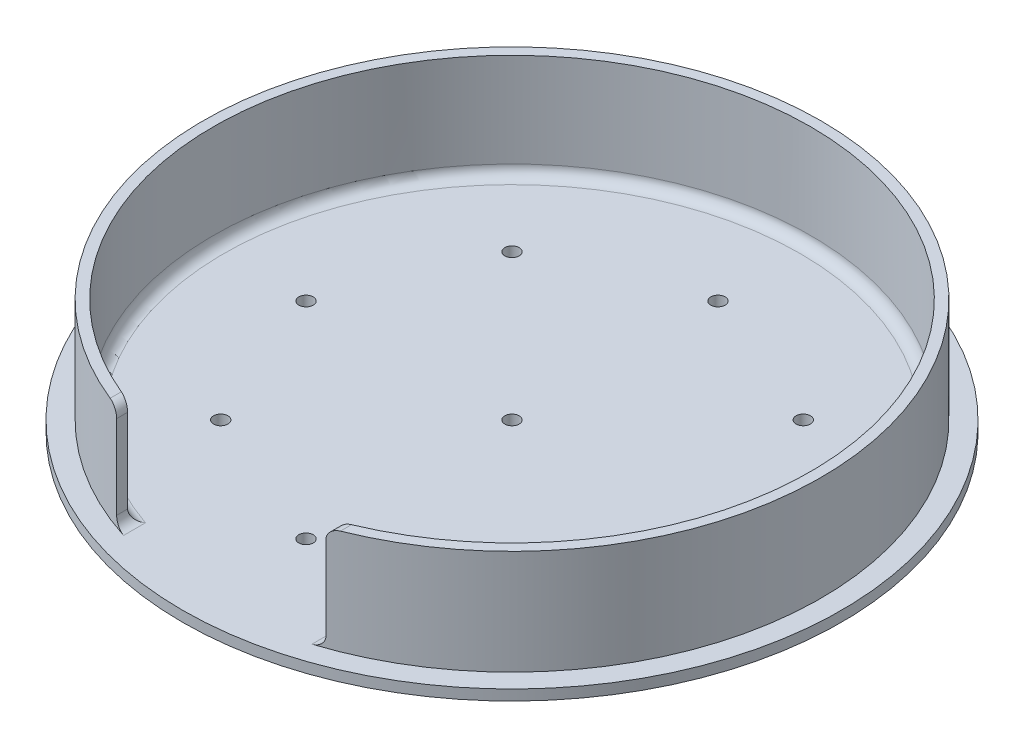
ISO-10303-21;
HEADER;
FILE_DESCRIPTION(('STEP AP214'),'2;1');
FILE_NAME('part.step','',(''),(''),'','','');
FILE_SCHEMA(('AUTOMOTIVE_DESIGN { 1 0 10303 214 1 1 1 1 }'));
ENDSEC;
DATA;
#1=APPLICATION_CONTEXT('core data for automotive mechanical design processes');
#2=APPLICATION_PROTOCOL_DEFINITION('international standard','automotive_design',2000,#1);
#3=PRODUCT_CONTEXT('',#1,'mechanical');
#4=PRODUCT('Part','Part','',(#3));
#5=PRODUCT_RELATED_PRODUCT_CATEGORY('part','',(#4));
#6=PRODUCT_DEFINITION_FORMATION('','',#4);
#7=PRODUCT_DEFINITION_CONTEXT('part definition',#1,'design');
#8=PRODUCT_DEFINITION('design','',#6,#7);
#9=PRODUCT_DEFINITION_SHAPE('','',#8);
#10=(LENGTH_UNIT() NAMED_UNIT(*) SI_UNIT(.MILLI.,.METRE.));
#11=(NAMED_UNIT(*) PLANE_ANGLE_UNIT() SI_UNIT($,.RADIAN.));
#12=(NAMED_UNIT(*) SI_UNIT($,.STERADIAN.) SOLID_ANGLE_UNIT());
#13=UNCERTAINTY_MEASURE_WITH_UNIT(LENGTH_MEASURE(1.E-05),#10,'distance_accuracy_value','');
#14=(GEOMETRIC_REPRESENTATION_CONTEXT(3) GLOBAL_UNCERTAINTY_ASSIGNED_CONTEXT((#13)) GLOBAL_UNIT_ASSIGNED_CONTEXT((#10,
#11,#12)) REPRESENTATION_CONTEXT('',''));
#15=CARTESIAN_POINT('',(0.,0.,0.));
#16=DIRECTION('',(0.,0.,1.));
#17=DIRECTION('',(1.,0.,0.));
#18=AXIS2_PLACEMENT_3D('',#15,#16,#17);
#19=CARTESIAN_POINT('',(0.,2.54,0.));
#20=DIRECTION('',(0.,-1.,0.));
#21=DIRECTION('',(0.,0.,-1.));
#22=AXIS2_PLACEMENT_3D('',#19,#20,#21);
#23=CYLINDRICAL_SURFACE('',#22,80.);
#24=CARTESIAN_POINT('',(0.,2.54,0.));
#25=DIRECTION('',(0.,1.,0.));
#26=DIRECTION('',(0.,0.,1.));
#27=AXIS2_PLACEMENT_3D('',#24,#25,#26);
#28=CIRCLE('',#27,80.);
#29=CARTESIAN_POINT('',(0.,2.54,80.));
#30=VERTEX_POINT('',#29);
#31=EDGE_CURVE('E116',#30,#30,#28,.T.);
#32=ORIENTED_EDGE('',*,*,#31,.F.);
#33=EDGE_LOOP('',(#32));
#34=FACE_BOUND('',#33,.T.);
#35=CARTESIAN_POINT('',(0.,0.,0.));
#36=DIRECTION('',(0.,1.,0.));
#37=DIRECTION('',(0.,0.,1.));
#38=AXIS2_PLACEMENT_3D('',#35,#36,#37);
#39=CIRCLE('',#38,80.);
#40=CARTESIAN_POINT('',(0.,0.,80.));
#41=VERTEX_POINT('',#40);
#42=EDGE_CURVE('E195',#41,#41,#39,.T.);
#43=ORIENTED_EDGE('',*,*,#42,.T.);
#44=EDGE_LOOP('',(#43));
#45=FACE_BOUND('',#44,.T.);
#46=ADVANCED_FACE('F32',(#34,#45),#23,.T.);
#47=CARTESIAN_POINT('',(0.,2.54,0.));
#48=DIRECTION('',(0.,1.,0.));
#49=DIRECTION('',(0.,0.,1.));
#50=AXIS2_PLACEMENT_3D('',#47,#48,#49);
#51=PLANE('',#50);
#52=CARTESIAN_POINT('',(0.,2.54,0.));
#53=DIRECTION('',(0.,1.,0.));
#54=DIRECTION('',(0.,0.,1.));
#55=AXIS2_PLACEMENT_3D('',#52,#53,#54);
#56=CIRCLE('',#55,75.);
#57=CARTESIAN_POINT('',(22.86,2.54,71.4312284648668));
#58=VERTEX_POINT('',#57);
#59=CARTESIAN_POINT('',(-22.86,2.54,71.4312284648668));
#60=VERTEX_POINT('',#59);
#61=EDGE_CURVE('E191',#58,#60,#56,.T.);
#62=ORIENTED_EDGE('',*,*,#61,.F.);
#63=DIRECTION('',(0.,0.,1.));
#64=VECTOR('',#63,1.);
#65=CARTESIAN_POINT('',(22.86,2.54,0.));
#66=LINE('',#65,#64);
#67=CARTESIAN_POINT('',(22.86,2.54,66.1197549904716));
#68=VERTEX_POINT('',#67);
#69=EDGE_CURVE('E290',#58,#68,#66,.F.);
#70=ORIENTED_EDGE('',*,*,#69,.T.);
#71=CARTESIAN_POINT('',(0.,2.54,0.));
#72=DIRECTION('',(0.,1.,0.));
#73=DIRECTION('',(0.,0.,1.));
#74=AXIS2_PLACEMENT_3D('',#71,#72,#73);
#75=CIRCLE('',#74,69.96);
#76=CARTESIAN_POINT('',(-22.86,2.54,66.1197549904716));
#77=VERTEX_POINT('',#76);
#78=EDGE_CURVE('E294',#68,#77,#75,.T.);
#79=ORIENTED_EDGE('',*,*,#78,.T.);
#80=DIRECTION('',(0.,0.,-1.));
#81=VECTOR('',#80,1.);
#82=CARTESIAN_POINT('',(-22.86,2.54,0.));
#83=LINE('',#82,#81);
#84=EDGE_CURVE('E296',#77,#60,#83,.F.);
#85=ORIENTED_EDGE('',*,*,#84,.T.);
#86=EDGE_LOOP('',(#62,#70,#79,#85));
#87=FACE_BOUND('',#86,.T.);
#88=ORIENTED_EDGE('',*,*,#31,.T.);
#89=EDGE_LOOP('',(#88));
#90=FACE_BOUND('',#89,.T.);
#91=CARTESIAN_POINT('',(0.,2.54,-50.));
#92=DIRECTION('',(0.,1.,0.));
#93=DIRECTION('',(0.,0.,1.));
#94=AXIS2_PLACEMENT_3D('',#91,#92,#93);
#95=CIRCLE('',#94,1.75);
#96=CARTESIAN_POINT('',(0.,2.54,-48.25));
#97=VERTEX_POINT('',#96);
#98=EDGE_CURVE('E140',#97,#97,#95,.T.);
#99=ORIENTED_EDGE('',*,*,#98,.F.);
#100=EDGE_LOOP('',(#99));
#101=FACE_BOUND('',#100,.T.);
#102=CARTESIAN_POINT('',(0.,2.54,0.));
#103=DIRECTION('',(0.,1.,0.));
#104=DIRECTION('',(0.,0.,1.));
#105=AXIS2_PLACEMENT_3D('',#102,#103,#104);
#106=CIRCLE('',#105,1.75);
#107=CARTESIAN_POINT('',(0.,2.54,1.75));
#108=VERTEX_POINT('',#107);
#109=EDGE_CURVE('E129',#108,#108,#106,.T.);
#110=ORIENTED_EDGE('',*,*,#109,.F.);
#111=EDGE_LOOP('',(#110));
#112=FACE_BOUND('',#111,.T.);
#113=CARTESIAN_POINT('',(-35.3553390593273,2.54,-35.3553390593274));
#114=DIRECTION('',(0.,1.,0.));
#115=DIRECTION('',(0.,0.,1.));
#116=AXIS2_PLACEMENT_3D('',#113,#114,#115);
#117=CIRCLE('',#116,1.75);
#118=CARTESIAN_POINT('',(-35.3553390593273,2.54,-33.6053390593274));
#119=VERTEX_POINT('',#118);
#120=EDGE_CURVE('E160',#119,#119,#117,.T.);
#121=ORIENTED_EDGE('',*,*,#120,.F.);
#122=EDGE_LOOP('',(#121));
#123=FACE_BOUND('',#122,.T.);
#124=CARTESIAN_POINT('',(-35.3553390593274,2.54,35.3553390593273));
#125=DIRECTION('',(0.,1.,0.));
#126=DIRECTION('',(0.,0.,1.));
#127=AXIS2_PLACEMENT_3D('',#124,#125,#126);
#128=CIRCLE('',#127,1.75);
#129=CARTESIAN_POINT('',(-35.3553390593274,2.54,37.1053390593273));
#130=VERTEX_POINT('',#129);
#131=EDGE_CURVE('E154',#130,#130,#128,.T.);
#132=ORIENTED_EDGE('',*,*,#131,.F.);
#133=EDGE_LOOP('',(#132));
#134=FACE_BOUND('',#133,.T.);
#135=CARTESIAN_POINT('',(35.3553390593273,2.54,35.3553390593274));
#136=DIRECTION('',(0.,1.,0.));
#137=DIRECTION('',(0.,0.,1.));
#138=AXIS2_PLACEMENT_3D('',#135,#136,#137);
#139=CIRCLE('',#138,1.75);
#140=CARTESIAN_POINT('',(35.3553390593273,2.54,37.1053390593274));
#141=VERTEX_POINT('',#140);
#142=EDGE_CURVE('E148',#141,#141,#139,.T.);
#143=ORIENTED_EDGE('',*,*,#142,.F.);
#144=EDGE_LOOP('',(#143));
#145=FACE_BOUND('',#144,.T.);
#146=CARTESIAN_POINT('',(50.,2.54,0.));
#147=DIRECTION('',(0.,1.,0.));
#148=DIRECTION('',(0.,0.,1.));
#149=AXIS2_PLACEMENT_3D('',#146,#147,#148);
#150=CIRCLE('',#149,1.75);
#151=CARTESIAN_POINT('',(50.,2.54,1.75));
#152=VERTEX_POINT('',#151);
#153=EDGE_CURVE('E182',#152,#152,#150,.T.);
#154=ORIENTED_EDGE('',*,*,#153,.F.);
#155=EDGE_LOOP('',(#154));
#156=FACE_BOUND('',#155,.T.);
#157=CARTESIAN_POINT('',(0.,2.54,50.));
#158=DIRECTION('',(0.,1.,0.));
#159=DIRECTION('',(0.,0.,1.));
#160=AXIS2_PLACEMENT_3D('',#157,#158,#159);
#161=CIRCLE('',#160,1.75);
#162=CARTESIAN_POINT('',(0.,2.54,51.75));
#163=VERTEX_POINT('',#162);
#164=EDGE_CURVE('E171',#163,#163,#161,.T.);
#165=ORIENTED_EDGE('',*,*,#164,.F.);
#166=EDGE_LOOP('',(#165));
#167=FACE_BOUND('',#166,.T.);
#168=CARTESIAN_POINT('',(-50.,2.54,0.));
#169=DIRECTION('',(0.,1.,0.));
#170=DIRECTION('',(0.,0.,1.));
#171=AXIS2_PLACEMENT_3D('',#168,#169,#170);
#172=CIRCLE('',#171,1.75);
#173=CARTESIAN_POINT('',(-50.,2.54,1.75));
#174=VERTEX_POINT('',#173);
#175=EDGE_CURVE('E172',#174,#174,#172,.T.);
#176=ORIENTED_EDGE('',*,*,#175,.F.);
#177=EDGE_LOOP('',(#176));
#178=FACE_BOUND('',#177,.T.);
#179=CARTESIAN_POINT('',(35.3553390593274,2.54,-35.3553390593273));
#180=DIRECTION('',(0.,1.,0.));
#181=DIRECTION('',(0.,0.,1.));
#182=AXIS2_PLACEMENT_3D('',#179,#180,#181);
#183=CIRCLE('',#182,1.75);
#184=CARTESIAN_POINT('',(35.3553390593274,2.54,-33.6053390593273));
#185=VERTEX_POINT('',#184);
#186=EDGE_CURVE('E147',#185,#185,#183,.T.);
#187=ORIENTED_EDGE('',*,*,#186,.F.);
#188=EDGE_LOOP('',(#187));
#189=FACE_BOUND('',#188,.T.);
#190=ADVANCED_FACE('F228',(#87,#90,#101,#112,#123,#134,#145,#156,#167,#178,#189),#51,.T.);
#191=CARTESIAN_POINT('',(0.,0.,0.));
#192=DIRECTION('',(0.,1.,0.));
#193=DIRECTION('',(0.,0.,1.));
#194=AXIS2_PLACEMENT_3D('',#191,#192,#193);
#195=PLANE('',#194);
#196=CARTESIAN_POINT('',(0.,0.,-50.));
#197=DIRECTION('',(0.,1.,0.));
#198=DIRECTION('',(0.,0.,1.));
#199=AXIS2_PLACEMENT_3D('',#196,#197,#198);
#200=CIRCLE('',#199,1.75);
#201=CARTESIAN_POINT('',(0.,0.,-48.25));
#202=VERTEX_POINT('',#201);
#203=EDGE_CURVE('E136',#202,#202,#200,.T.);
#204=ORIENTED_EDGE('',*,*,#203,.T.);
#205=EDGE_LOOP('',(#204));
#206=FACE_BOUND('',#205,.T.);
#207=CARTESIAN_POINT('',(0.,0.,0.));
#208=DIRECTION('',(0.,1.,0.));
#209=DIRECTION('',(0.,0.,1.));
#210=AXIS2_PLACEMENT_3D('',#207,#208,#209);
#211=CIRCLE('',#210,1.75);
#212=CARTESIAN_POINT('',(0.,0.,1.75));
#213=VERTEX_POINT('',#212);
#214=EDGE_CURVE('E163',#213,#213,#211,.T.);
#215=ORIENTED_EDGE('',*,*,#214,.T.);
#216=EDGE_LOOP('',(#215));
#217=FACE_BOUND('',#216,.T.);
#218=CARTESIAN_POINT('',(-35.3553390593273,0.,-35.3553390593274));
#219=DIRECTION('',(0.,1.,0.));
#220=DIRECTION('',(0.,0.,1.));
#221=AXIS2_PLACEMENT_3D('',#218,#219,#220);
#222=CIRCLE('',#221,1.75);
#223=CARTESIAN_POINT('',(-35.3553390593273,0.,-33.6053390593274));
#224=VERTEX_POINT('',#223);
#225=EDGE_CURVE('E157',#224,#224,#222,.T.);
#226=ORIENTED_EDGE('',*,*,#225,.T.);
#227=EDGE_LOOP('',(#226));
#228=FACE_BOUND('',#227,.T.);
#229=CARTESIAN_POINT('',(-35.3553390593274,0.,35.3553390593273));
#230=DIRECTION('',(0.,1.,0.));
#231=DIRECTION('',(0.,0.,1.));
#232=AXIS2_PLACEMENT_3D('',#229,#230,#231);
#233=CIRCLE('',#232,1.75);
#234=CARTESIAN_POINT('',(-35.3553390593274,0.,37.1053390593273));
#235=VERTEX_POINT('',#234);
#236=EDGE_CURVE('E151',#235,#235,#233,.T.);
#237=ORIENTED_EDGE('',*,*,#236,.T.);
#238=EDGE_LOOP('',(#237));
#239=FACE_BOUND('',#238,.T.);
#240=CARTESIAN_POINT('',(35.3553390593273,0.,35.3553390593274));
#241=DIRECTION('',(0.,1.,0.));
#242=DIRECTION('',(0.,0.,1.));
#243=AXIS2_PLACEMENT_3D('',#240,#241,#242);
#244=CIRCLE('',#243,1.75);
#245=CARTESIAN_POINT('',(35.3553390593273,0.,37.1053390593274));
#246=VERTEX_POINT('',#245);
#247=EDGE_CURVE('E144',#246,#246,#244,.T.);
#248=ORIENTED_EDGE('',*,*,#247,.T.);
#249=EDGE_LOOP('',(#248));
#250=FACE_BOUND('',#249,.T.);
#251=CARTESIAN_POINT('',(50.,0.,0.));
#252=DIRECTION('',(0.,1.,0.));
#253=DIRECTION('',(0.,0.,1.));
#254=AXIS2_PLACEMENT_3D('',#251,#252,#253);
#255=CIRCLE('',#254,1.75);
#256=CARTESIAN_POINT('',(50.,0.,1.75));
#257=VERTEX_POINT('',#256);
#258=EDGE_CURVE('E143',#257,#257,#255,.T.);
#259=ORIENTED_EDGE('',*,*,#258,.T.);
#260=EDGE_LOOP('',(#259));
#261=FACE_BOUND('',#260,.T.);
#262=CARTESIAN_POINT('',(0.,0.,50.));
#263=DIRECTION('',(0.,1.,0.));
#264=DIRECTION('',(0.,0.,1.));
#265=AXIS2_PLACEMENT_3D('',#262,#263,#264);
#266=CIRCLE('',#265,1.75);
#267=CARTESIAN_POINT('',(0.,0.,51.75));
#268=VERTEX_POINT('',#267);
#269=EDGE_CURVE('E185',#268,#268,#266,.T.);
#270=ORIENTED_EDGE('',*,*,#269,.T.);
#271=EDGE_LOOP('',(#270));
#272=FACE_BOUND('',#271,.T.);
#273=CARTESIAN_POINT('',(-50.,0.,0.));
#274=DIRECTION('',(0.,1.,0.));
#275=DIRECTION('',(0.,0.,1.));
#276=AXIS2_PLACEMENT_3D('',#273,#274,#275);
#277=CIRCLE('',#276,1.75);
#278=CARTESIAN_POINT('',(-50.,0.,1.75));
#279=VERTEX_POINT('',#278);
#280=EDGE_CURVE('E168',#279,#279,#277,.T.);
#281=ORIENTED_EDGE('',*,*,#280,.T.);
#282=EDGE_LOOP('',(#281));
#283=FACE_BOUND('',#282,.T.);
#284=CARTESIAN_POINT('',(35.3553390593274,0.,-35.3553390593273));
#285=DIRECTION('',(0.,1.,0.));
#286=DIRECTION('',(0.,0.,1.));
#287=AXIS2_PLACEMENT_3D('',#284,#285,#286);
#288=CIRCLE('',#287,1.75);
#289=CARTESIAN_POINT('',(35.3553390593274,0.,-33.6053390593273));
#290=VERTEX_POINT('',#289);
#291=EDGE_CURVE('E175',#290,#290,#288,.T.);
#292=ORIENTED_EDGE('',*,*,#291,.T.);
#293=EDGE_LOOP('',(#292));
#294=FACE_BOUND('',#293,.T.);
#295=ORIENTED_EDGE('',*,*,#42,.F.);
#296=EDGE_LOOP('',(#295));
#297=FACE_BOUND('',#296,.T.);
#298=ADVANCED_FACE('F223',(#206,#217,#228,#239,#250,#261,#272,#283,#294,#297),#195,.F.);
#299=CARTESIAN_POINT('',(0.,27.94,0.));
#300=DIRECTION('',(0.,1.,0.));
#301=DIRECTION('',(0.,0.,1.));
#302=AXIS2_PLACEMENT_3D('',#299,#300,#301);
#303=PLANE('',#302);
#304=CARTESIAN_POINT('',(0.,27.94,0.));
#305=DIRECTION('',(0.,1.,0.));
#306=DIRECTION('',(0.,0.,1.));
#307=AXIS2_PLACEMENT_3D('',#304,#305,#306);
#308=CIRCLE('',#307,75.);
#309=CARTESIAN_POINT('',(27.94,27.94,69.6014109052396));
#310=VERTEX_POINT('',#309);
#311=CARTESIAN_POINT('',(-27.94,27.94,69.6014109052396));
#312=VERTEX_POINT('',#311);
#313=EDGE_CURVE('E192',#310,#312,#308,.T.);
#314=ORIENTED_EDGE('',*,*,#313,.T.);
#315=DIRECTION('',(0.,0.,1.));
#316=VECTOR('',#315,1.);
#317=CARTESIAN_POINT('',(-27.94,27.94,67.905007179147));
#318=LINE('',#317,#316);
#319=CARTESIAN_POINT('',(-27.94,27.94,66.899973094165));
#320=VERTEX_POINT('',#319);
#321=EDGE_CURVE('E298',#312,#320,#318,.F.);
#322=ORIENTED_EDGE('',*,*,#321,.T.);
#323=CARTESIAN_POINT('',(0.,27.94,0.));
#324=DIRECTION('',(0.,1.,0.));
#325=DIRECTION('',(0.,0.,1.));
#326=AXIS2_PLACEMENT_3D('',#323,#324,#325);
#327=CIRCLE('',#326,72.5);
#328=CARTESIAN_POINT('',(27.94,27.94,66.899973094165));
#329=VERTEX_POINT('',#328);
#330=EDGE_CURVE('E139',#329,#320,#327,.T.);
#331=ORIENTED_EDGE('',*,*,#330,.F.);
#332=DIRECTION('',(0.,0.,-1.));
#333=VECTOR('',#332,1.);
#334=CARTESIAN_POINT('',(27.94,27.94,70.5679814080012));
#335=LINE('',#334,#333);
#336=EDGE_CURVE('E110',#329,#310,#335,.F.);
#337=ORIENTED_EDGE('',*,*,#336,.T.);
#338=EDGE_LOOP('',(#314,#322,#331,#337));
#339=FACE_BOUND('',#338,.T.);
#340=ADVANCED_FACE('F219',(#339),#303,.T.);
#341=CARTESIAN_POINT('',(0.,27.94,0.));
#342=DIRECTION('',(0.,-1.,0.));
#343=DIRECTION('',(0.,0.,-1.));
#344=AXIS2_PLACEMENT_3D('',#341,#342,#343);
#345=CYLINDRICAL_SURFACE('',#344,75.);
#346=DIRECTION('',(0.,-1.,0.));
#347=VECTOR('',#346,1.);
#348=CARTESIAN_POINT('',(-25.4,27.94,70.5679814080012));
#349=LINE('',#348,#347);
#350=CARTESIAN_POINT('',(-25.4,5.08,70.5679814080012));
#351=VERTEX_POINT('',#350);
#352=CARTESIAN_POINT('',(-25.4,25.4,70.5679814080012));
#353=VERTEX_POINT('',#352);
#354=EDGE_CURVE('E127',#351,#353,#349,.F.);
#355=ORIENTED_EDGE('',*,*,#354,.T.);
#356=CARTESIAN_POINT('',(-25.4,25.4,70.5679814080012));
#357=CARTESIAN_POINT('',(-25.3999911231022,25.4683009404171,70.5679838437959));
#358=CARTESIAN_POINT('',(-25.4027547850899,25.5365974723115,70.5669898406819));
#359=CARTESIAN_POINT('',(-25.4137590531762,25.6726798098178,70.5630279490641));
#360=CARTESIAN_POINT('',(-25.4219988001639,25.7404656938555,70.560060370183));
#361=CARTESIAN_POINT('',(-25.443862404093,25.8748944455611,70.552179226466));
#362=CARTESIAN_POINT('',(-25.4574740477804,25.9415395506981,70.5472700758288));
#363=CARTESIAN_POINT('',(-25.4899364155857,26.0733515815466,70.5355473296935));
#364=CARTESIAN_POINT('',(-25.5087871838008,26.1385184948112,70.5287337181657));
#365=CARTESIAN_POINT('',(-25.5729568234081,26.3311118582581,70.5055031700523));
#366=CARTESIAN_POINT('',(-25.6259142209375,26.4557595257513,70.4862889293215));
#367=CARTESIAN_POINT('',(-25.7502283684309,26.6940635409297,70.4409688071902));
#368=CARTESIAN_POINT('',(-25.8215897376738,26.8077171193067,70.4148611955584));
#369=CARTESIAN_POINT('',(-25.9821627721674,27.0238856338973,70.3557722076538));
#370=CARTESIAN_POINT('',(-26.0717477310038,27.1260837113047,70.3226463560984));
#371=CARTESIAN_POINT('',(-26.2648086491254,27.3140271825126,70.2507681512969));
#372=CARTESIAN_POINT('',(-26.3682875252042,27.3997691124152,70.212014616474));
#373=CARTESIAN_POINT('',(-26.5922701238937,27.5575511961076,70.1275000368474));
#374=CARTESIAN_POINT('',(-26.7134038102839,27.6285505026887,70.081467571078));
#375=CARTESIAN_POINT('',(-26.9643639117677,27.7492844663632,69.9852924129325));
#376=CARTESIAN_POINT('',(-27.0941938952845,27.7990103315578,69.9351480313643));
#377=CARTESIAN_POINT('',(-27.3430352824417,27.8718305275104,69.8381984718557));
#378=CARTESIAN_POINT('',(-27.4614562040145,27.8974183082758,69.791722854575));
#379=CARTESIAN_POINT('',(-27.6999649550538,27.9315024882515,69.697407957412));
#380=CARTESIAN_POINT('',(-27.8200495805451,27.9400280987028,69.6495711506475));
#381=CARTESIAN_POINT('',(-27.94,27.94,69.6014109052396));
#382=B_SPLINE_CURVE_WITH_KNOTS('',3,(#356,#357,#358,#359,#360,#361,#362,#363,#364,#365,#366,
#367,#368,#369,#370,#371,#372,#373,#374,#375,#376,#377,#378,#379,#380,#381),.UNSPECIFIED.,.F.,
.F.,(4,2,2,2,2,2,2,2,2,2,2,2,4),(0.,0.204832073003706,0.409632018681645,0.613969000116901,
0.818307701489196,1.22659840389449,1.63499168455571,2.05279166394226,2.47067949092533,
2.91205255380175,3.35360785175976,3.74176306096528,4.12925315967979),.UNSPECIFIED.);
#383=EDGE_CURVE('E240',#353,#312,#382,.T.);
#384=ORIENTED_EDGE('',*,*,#383,.T.);
#385=ORIENTED_EDGE('',*,*,#313,.F.);
#386=CARTESIAN_POINT('',(27.94,27.94,69.6014109052396));
#387=CARTESIAN_POINT('',(27.8650153320725,27.9399962807762,69.6315126271906));
#388=CARTESIAN_POINT('',(27.7900145828547,27.936677535673,69.6614784550949));
#389=CARTESIAN_POINT('',(27.6404159494081,27.9233903785957,69.7209715556729));
#390=CARTESIAN_POINT('',(27.5658181327498,27.9134208842017,69.7504987561594));
#391=CARTESIAN_POINT('',(27.3431864850741,27.8734847662077,69.8382095469309));
#392=CARTESIAN_POINT('',(27.1964496243437,27.8334904358694,69.8954680926128));
#393=CARTESIAN_POINT('',(26.9109377406109,27.7272074727844,70.005892275249));
#394=CARTESIAN_POINT('',(26.7721753775717,27.6608782838782,70.0590514475881));
#395=CARTESIAN_POINT('',(26.507498353874,27.5031454764643,70.1596219421899));
#396=CARTESIAN_POINT('',(26.3815709947969,27.4117669776168,70.2070389544214));
#397=CARTESIAN_POINT('',(26.1523299964071,27.2105448234959,70.2927449339574));
#398=CARTESIAN_POINT('',(26.048265460546,27.101689827593,70.3313436019472));
#399=CARTESIAN_POINT('',(25.8600665928956,26.8656834881734,70.4007602813931));
#400=CARTESIAN_POINT('',(25.7759325580948,26.7385318720604,70.4315781769068));
#401=CARTESIAN_POINT('',(25.6359956674853,26.4786630903542,70.4826285526747));
#402=CARTESIAN_POINT('',(25.5786940226309,26.3468611965368,70.503423694416));
#403=CARTESIAN_POINT('',(25.4870313528889,26.0746072866087,70.5366120838995));
#404=CARTESIAN_POINT('',(25.452634997823,25.9341689589819,70.5490182716102));
#405=CARTESIAN_POINT('',(25.4202767065062,25.7269824289477,70.5606804513457));
#406=CARTESIAN_POINT('',(25.4126747312273,25.6617974077086,70.5634183021374));
#407=CARTESIAN_POINT('',(25.4025407347921,25.5310863629682,70.5670669849594));
#408=CARTESIAN_POINT('',(25.4000008006586,25.4655610324771,70.56798066853));
#409=CARTESIAN_POINT('',(25.4,25.4,70.5679814080012));
#410=B_SPLINE_CURVE_WITH_KNOTS('',3,(#386,#387,#388,#389,#390,#391,#392,#393,#394,#395,#396,
#397,#398,#399,#400,#401,#402,#403,#404,#405,#406,#407,#408,#409),.UNSPECIFIED.,.F.,.F.,(4,2,2,
2,2,2,2,2,2,2,2,4),(0.,0.242262024768758,0.484563487687661,0.969597963538735,1.4553823167571,
1.94068129222948,2.40464022827178,2.86860607742748,3.30207340686002,3.73487057795399,
3.93173548843062,4.12829241775815),.UNSPECIFIED.);
#411=CARTESIAN_POINT('',(25.4,25.4,70.5679814080012));
#412=VERTEX_POINT('',#411);
#413=EDGE_CURVE('E63',#310,#412,#410,.T.);
#414=ORIENTED_EDGE('',*,*,#413,.T.);
#415=DIRECTION('',(0.,-1.,0.));
#416=VECTOR('',#415,1.);
#417=CARTESIAN_POINT('',(25.4,27.94,70.5679814080012));
#418=LINE('',#417,#416);
#419=CARTESIAN_POINT('',(25.4,5.08,70.5679814080012));
#420=VERTEX_POINT('',#419);
#421=EDGE_CURVE('E120',#412,#420,#418,.T.);
#422=ORIENTED_EDGE('',*,*,#421,.T.);
#423=CARTESIAN_POINT('',(25.4,5.08,70.5679814080012));
#424=CARTESIAN_POINT('',(25.4000089484439,5.01151405162951,70.5679774204192));
#425=CARTESIAN_POINT('',(25.3972302810593,4.94303283699534,70.5689783119278));
#426=CARTESIAN_POINT('',(25.3861665765842,4.80658652708023,70.5729594798142));
#427=CARTESIAN_POINT('',(25.3778825270015,4.73862134144938,70.5759394012107));
#428=CARTESIAN_POINT('',(25.3559037790285,4.60385379607863,70.5838386061601));
#429=CARTESIAN_POINT('',(25.3422223605247,4.53704899932469,70.5887531296823));
#430=CARTESIAN_POINT('',(25.3095938312956,4.40492429723824,70.6004586269988));
#431=CARTESIAN_POINT('',(25.2906466489462,4.33960441211639,70.6072496263165));
#432=CARTESIAN_POINT('',(25.2261518345231,4.14657556698979,70.6303290118472));
#433=CARTESIAN_POINT('',(25.1729271766754,4.02165362273051,70.6493323784891));
#434=CARTESIAN_POINT('',(25.047929786864,3.78278134507579,70.6937450124226));
#435=CARTESIAN_POINT('',(24.9761510725031,3.66883456670615,70.7191563457745));
#436=CARTESIAN_POINT('',(24.8142199962055,3.45167680591809,70.7761402289921));
#437=CARTESIAN_POINT('',(24.7236338188473,3.34882726255911,70.8078573204497));
#438=CARTESIAN_POINT('',(24.5280605947998,3.15966146434906,70.8758418032929));
#439=CARTESIAN_POINT('',(24.4230694388609,3.07334994413082,70.9121104928416));
#440=CARTESIAN_POINT('',(24.1954130227815,2.91468949690491,70.9901206460853));
#441=CARTESIAN_POINT('',(24.0720913469597,2.84337707691652,71.0320538678189));
#442=CARTESIAN_POINT('',(23.8159884708466,2.72251475024653,71.1183306247842));
#443=CARTESIAN_POINT('',(23.6832068109659,2.67296590173188,71.1626742770957));
#444=CARTESIAN_POINT('',(23.4355807751665,2.60334619151851,71.2445604652449));
#445=CARTESIAN_POINT('',(23.3216881350764,2.57962384830795,71.2819277378381));
#446=CARTESIAN_POINT('',(23.0919045420164,2.54794839340104,71.3567010209717));
#447=CARTESIAN_POINT('',(22.9760162723534,2.5399755559169,71.3941069242712));
#448=CARTESIAN_POINT('',(22.86,2.54,71.4312284648668));
#449=B_SPLINE_CURVE_WITH_KNOTS('',3,(#423,#424,#425,#426,#427,#428,#429,#430,#431,#432,#433,
#434,#435,#436,#437,#438,#439,#440,#441,#442,#443,#444,#445,#446,#447,#448),.UNSPECIFIED.,.F.,
.F.,(4,2,2,2,2,2,2,2,2,2,2,2,4),(0.,0.205386045319169,0.410735260209711,0.615582346245656,
0.820432218720946,1.22969950039094,1.63909890735093,2.05927216890965,2.47956554176718,
2.92310877554039,3.36667357244974,3.73223795629847,4.09734419058968),.UNSPECIFIED.);
#450=EDGE_CURVE('E48',#420,#58,#449,.T.);
#451=ORIENTED_EDGE('',*,*,#450,.T.);
#452=ORIENTED_EDGE('',*,*,#61,.T.);
#453=CARTESIAN_POINT('',(-22.86,2.54,71.4312284648668));
#454=CARTESIAN_POINT('',(-22.9346696765728,2.54000256400076,71.4073327740972));
#455=CARTESIAN_POINT('',(-23.0092649817566,2.54329441636472,71.3833302385938));
#456=CARTESIAN_POINT('',(-23.1578574699347,2.55642085713746,71.3352628196709));
#457=CARTESIAN_POINT('',(-23.2318546523655,2.56625545170945,71.3111979361927));
#458=CARTESIAN_POINT('',(-23.4522212134421,2.60551004452718,71.2391543417681));
#459=CARTESIAN_POINT('',(-23.5970206521262,2.64468090768826,71.1913090599644));
#460=CARTESIAN_POINT('',(-23.8780746895329,2.7481353958831,71.0975356271752));
#461=CARTESIAN_POINT('',(-24.0143229713235,2.81243733818284,71.0516089016538));
#462=CARTESIAN_POINT('',(-24.2741291687854,2.96470359178416,70.9632684527281));
#463=CARTESIAN_POINT('',(-24.3976929516464,3.05265689443245,70.9208531069156));
#464=CARTESIAN_POINT('',(-24.6258564442808,3.24820199702362,70.8419474050057));
#465=CARTESIAN_POINT('',(-24.730782160807,3.35537218076898,70.805356676415));
#466=CARTESIAN_POINT('',(-24.9209284922918,3.58778910076999,70.7386563697831));
#467=CARTESIAN_POINT('',(-25.0061492231005,3.71303573074308,70.7085467536382));
#468=CARTESIAN_POINT('',(-25.1496624613284,3.97107370142317,70.6576251826043));
#469=CARTESIAN_POINT('',(-25.2091211497569,4.10313819708719,70.6364124115518));
#470=CARTESIAN_POINT('',(-25.3048546857908,4.37632740000026,70.6021738358704));
#471=CARTESIAN_POINT('',(-25.3411638964484,4.51743833441687,70.5891358970109));
#472=CARTESIAN_POINT('',(-25.3767467492841,4.72994441749008,70.5763477001517));
#473=CARTESIAN_POINT('',(-25.385462839911,4.79968230979124,70.5732125660305));
#474=CARTESIAN_POINT('',(-25.3970856671319,4.93960087371583,70.569030463692));
#475=CARTESIAN_POINT('',(-25.4000007847718,5.00978075938187,70.5679804829214));
#476=CARTESIAN_POINT('',(-25.4,5.08,70.5679814080012));
#477=B_SPLINE_CURVE_WITH_KNOTS('',3,(#453,#454,#455,#456,#457,#458,#459,#460,#461,#462,#463,
#464,#465,#466,#467,#468,#469,#470,#471,#472,#473,#474,#475,#476),.UNSPECIFIED.,.F.,.F.,(4,2,2,
2,2,2,2,2,2,2,2,4),(0.,0.235055271684616,0.470110764789532,0.940050529334855,1.41033345914206,
1.88039787097955,2.34118972624421,2.80197887234036,3.23889998815238,3.67517101952237,
3.88598778317026,4.09649974424323),.UNSPECIFIED.);
#478=EDGE_CURVE('E11',#60,#351,#477,.T.);
#479=ORIENTED_EDGE('',*,*,#478,.T.);
#480=EDGE_LOOP('',(#355,#384,#385,#414,#422,#451,#452,#479));
#481=FACE_BOUND('',#480,.T.);
#482=ADVANCED_FACE('F216',(#481),#345,.T.);
#483=CARTESIAN_POINT('',(0.,27.94,0.));
#484=DIRECTION('',(0.,-1.,0.));
#485=DIRECTION('',(0.,0.,-1.));
#486=AXIS2_PLACEMENT_3D('',#483,#484,#485);
#487=CYLINDRICAL_SURFACE('',#486,72.5);
#488=DIRECTION('',(0.,-1.,0.));
#489=VECTOR('',#488,1.);
#490=CARTESIAN_POINT('',(-25.4,27.94,67.905007179147));
#491=LINE('',#490,#489);
#492=CARTESIAN_POINT('',(-25.4,5.08,67.905007179147));
#493=VERTEX_POINT('',#492);
#494=CARTESIAN_POINT('',(-25.4,25.4,67.905007179147));
#495=VERTEX_POINT('',#494);
#496=EDGE_CURVE('E132',#493,#495,#491,.F.);
#497=ORIENTED_EDGE('',*,*,#496,.F.);
#498=CARTESIAN_POINT('',(0.,5.08,0.));
#499=DIRECTION('',(0.,1.,0.));
#500=DIRECTION('',(0.,0.,1.));
#501=AXIS2_PLACEMENT_3D('',#498,#499,#500);
#502=CIRCLE('',#501,72.5);
#503=CARTESIAN_POINT('',(25.4,5.08,67.9050071791469));
#504=VERTEX_POINT('',#503);
#505=EDGE_CURVE('E126',#493,#504,#502,.F.);
#506=ORIENTED_EDGE('',*,*,#505,.T.);
#507=DIRECTION('',(0.,-1.,0.));
#508=VECTOR('',#507,1.);
#509=CARTESIAN_POINT('',(25.4,27.94,67.9050071791469));
#510=LINE('',#509,#508);
#511=CARTESIAN_POINT('',(25.4,25.4,67.9050071791469));
#512=VERTEX_POINT('',#511);
#513=EDGE_CURVE('E119',#512,#504,#510,.T.);
#514=ORIENTED_EDGE('',*,*,#513,.F.);
#515=CARTESIAN_POINT('',(25.4,25.4,67.9050071791469));
#516=CARTESIAN_POINT('',(25.3999909918562,25.4680748873589,67.9050097630684));
#517=CARTESIAN_POINT('',(25.4027365714527,25.5361452812484,67.9039835393348));
#518=CARTESIAN_POINT('',(25.4136677901491,25.6717753173865,67.8998936062275));
#519=CARTESIAN_POINT('',(25.4218525320514,25.7393350420121,67.8968302328844));
#520=CARTESIAN_POINT('',(25.4435672904121,25.873306123909,67.8886957495223));
#521=CARTESIAN_POINT('',(25.4570846180147,25.9397198194237,67.883629405499));
#522=CARTESIAN_POINT('',(25.4893180453244,26.0710722022835,67.8715327640025));
#523=CARTESIAN_POINT('',(25.5080341968139,26.1360108749299,67.8645024469674));
#524=CARTESIAN_POINT('',(25.5717348723975,26.3279221121436,67.8405370095667));
#525=CARTESIAN_POINT('',(25.6242935610411,26.4521234365137,67.8207192345947));
#526=CARTESIAN_POINT('',(25.7476271119313,26.6895897833392,67.7739921920354));
#527=CARTESIAN_POINT('',(25.8184071037731,26.8028517138087,67.7470809274636));
#528=CARTESIAN_POINT('',(25.977734267022,27.0184904902643,67.6861489032155));
#529=CARTESIAN_POINT('',(26.0666754026977,27.120531338487,67.6519696470092));
#530=CARTESIAN_POINT('',(26.2582971625528,27.3082673532033,67.577824577654));
#531=CARTESIAN_POINT('',(26.3609806356297,27.3939591214421,67.5378575645151));
#532=CARTESIAN_POINT('',(26.5836274666216,27.5521158626724,67.4505438566138));
#533=CARTESIAN_POINT('',(26.7042590491798,27.6234735311052,67.4028976924469));
#534=CARTESIAN_POINT('',(26.9541710665477,27.7450084117972,67.3033489242588));
#535=CARTESIAN_POINT('',(27.083455639102,27.7951754059112,67.2514442811717));
#536=CARTESIAN_POINT('',(27.3335458625656,27.8696204600305,67.1501560890864));
#537=CARTESIAN_POINT('',(27.4538419224427,27.8960425126912,67.1010686256025));
#538=CARTESIAN_POINT('',(27.6961463562578,27.9312313820236,67.0014249817953));
#539=CARTESIAN_POINT('',(27.8181513605068,27.9400290533971,66.9508715256959));
#540=CARTESIAN_POINT('',(27.94,27.94,66.899973094165));
#541=B_SPLINE_CURVE_WITH_KNOTS('',3,(#515,#516,#517,#518,#519,#520,#521,#522,#523,#524,#525,
#526,#527,#528,#529,#530,#531,#532,#533,#534,#535,#536,#537,#538,#539,#540),.UNSPECIFIED.,.F.,
.F.,(4,2,2,2,2,2,2,2,2,2,2,2,4),(0.,0.204153827866176,0.408273988616335,0.611911348223606,
0.815550736210098,1.22242791792374,1.62941976772092,2.04641577900681,2.46349837122384,
2.90569821157868,3.34811103799479,3.74468020329713,4.14055449291732),.UNSPECIFIED.);
#542=EDGE_CURVE('E107',#512,#329,#541,.T.);
#543=ORIENTED_EDGE('',*,*,#542,.T.);
#544=ORIENTED_EDGE('',*,*,#330,.T.);
#545=CARTESIAN_POINT('',(-27.94,27.94,66.899973094165));
#546=CARTESIAN_POINT('',(-27.8647245166625,27.9399959970942,66.9314117970909));
#547=CARTESIAN_POINT('',(-27.7894284225434,27.9366517228738,66.9627081607048));
#548=CARTESIAN_POINT('',(-27.6392296836314,27.9232584046594,67.0248429794836));
#549=CARTESIAN_POINT('',(-27.5643271120041,27.9132081554269,67.0556813513168));
#550=CARTESIAN_POINT('',(-27.3407367579429,27.8729340065067,67.1473005910123));
#551=CARTESIAN_POINT('',(-27.1933360507702,27.8325865925142,67.2071147385183));
#552=CARTESIAN_POINT('',(-26.9064966487967,27.7252915611199,67.3224660314285));
#553=CARTESIAN_POINT('',(-26.7670713682998,27.6583005527883,67.3779960227779));
#554=CARTESIAN_POINT('',(-26.5011759920491,27.498894444618,67.4830206695115));
#555=CARTESIAN_POINT('',(-26.374692147811,27.4065067183133,67.5325217406624));
#556=CARTESIAN_POINT('',(-26.1450372835275,27.2033537888852,67.6217532642504));
#557=CARTESIAN_POINT('',(-26.0410404339214,27.0936792653706,67.6618378621398));
#558=CARTESIAN_POINT('',(-25.8531390944418,26.8558659666091,67.7338567927448));
#559=CARTESIAN_POINT('',(-25.7692344749964,26.7277273104434,67.7657911780202));
#560=CARTESIAN_POINT('',(-25.6303591242271,26.4665308424638,67.8184328441663));
#561=CARTESIAN_POINT('',(-25.5737601586588,26.3344640237668,67.8397750458677));
#562=CARTESIAN_POINT('',(-25.4835316936018,26.0617459696653,67.8737207774607));
#563=CARTESIAN_POINT('',(-25.4498650332668,25.9211090267119,67.8863384455998));
#564=CARTESIAN_POINT('',(-25.4189242472208,25.7159318527631,67.8979261058727));
#565=CARTESIAN_POINT('',(-25.4118290422509,25.6529346118807,67.9005815732406));
#566=CARTESIAN_POINT('',(-25.4023712975497,25.5266359838726,67.9041202747758));
#567=CARTESIAN_POINT('',(-25.4000013430296,25.4633352297508,67.9050062855502));
#568=CARTESIAN_POINT('',(-25.4,25.4,67.9050071791469));
#569=B_SPLINE_CURVE_WITH_KNOTS('',3,(#545,#546,#547,#548,#549,#550,#551,#552,#553,#554,#555,
#556,#557,#558,#559,#560,#561,#562,#563,#564,#565,#566,#567,#568),.UNSPECIFIED.,.F.,.F.,(4,2,2,
2,2,2,2,2,2,2,2,4),(0.,0.244588632454884,0.489221235709295,0.979031388231789,1.46964251831437,
1.95972690882484,2.42636464461434,2.89299937104001,3.32658818683027,3.75947270774219,
3.94965827669573,4.13954517382228),.UNSPECIFIED.);
#570=EDGE_CURVE('E115',#320,#495,#569,.T.);
#571=ORIENTED_EDGE('',*,*,#570,.T.);
#572=EDGE_LOOP('',(#497,#506,#514,#543,#544,#571));
#573=FACE_BOUND('',#572,.T.);
#574=ADVANCED_FACE('F124',(#573),#487,.F.);
#575=CARTESIAN_POINT('',(35.3553390593274,0.,-35.3553390593273));
#576=DIRECTION('',(0.,1.,0.));
#577=DIRECTION('',(0.,0.,1.));
#578=AXIS2_PLACEMENT_3D('',#575,#576,#577);
#579=CYLINDRICAL_SURFACE('',#578,1.75);
#580=ORIENTED_EDGE('',*,*,#291,.F.);
#581=EDGE_LOOP('',(#580));
#582=FACE_BOUND('',#581,.T.);
#583=ORIENTED_EDGE('',*,*,#186,.T.);
#584=EDGE_LOOP('',(#583));
#585=FACE_BOUND('',#584,.T.);
#586=ADVANCED_FACE('F215',(#582,#585),#579,.F.);
#587=CARTESIAN_POINT('',(-50.,0.,0.));
#588=DIRECTION('',(0.,1.,0.));
#589=DIRECTION('',(0.,0.,1.));
#590=AXIS2_PLACEMENT_3D('',#587,#588,#589);
#591=CYLINDRICAL_SURFACE('',#590,1.75);
#592=ORIENTED_EDGE('',*,*,#280,.F.);
#593=EDGE_LOOP('',(#592));
#594=FACE_BOUND('',#593,.T.);
#595=ORIENTED_EDGE('',*,*,#175,.T.);
#596=EDGE_LOOP('',(#595));
#597=FACE_BOUND('',#596,.T.);
#598=ADVANCED_FACE('F341',(#594,#597),#591,.F.);
#599=CARTESIAN_POINT('',(0.,0.,50.));
#600=DIRECTION('',(0.,1.,0.));
#601=DIRECTION('',(0.,0.,1.));
#602=AXIS2_PLACEMENT_3D('',#599,#600,#601);
#603=CYLINDRICAL_SURFACE('',#602,1.75);
#604=ORIENTED_EDGE('',*,*,#269,.F.);
#605=EDGE_LOOP('',(#604));
#606=FACE_BOUND('',#605,.T.);
#607=ORIENTED_EDGE('',*,*,#164,.T.);
#608=EDGE_LOOP('',(#607));
#609=FACE_BOUND('',#608,.T.);
#610=ADVANCED_FACE('F217',(#606,#609),#603,.F.);
#611=CARTESIAN_POINT('',(50.,0.,0.));
#612=DIRECTION('',(0.,1.,0.));
#613=DIRECTION('',(0.,0.,1.));
#614=AXIS2_PLACEMENT_3D('',#611,#612,#613);
#615=CYLINDRICAL_SURFACE('',#614,1.75);
#616=ORIENTED_EDGE('',*,*,#258,.F.);
#617=EDGE_LOOP('',(#616));
#618=FACE_BOUND('',#617,.T.);
#619=ORIENTED_EDGE('',*,*,#153,.T.);
#620=EDGE_LOOP('',(#619));
#621=FACE_BOUND('',#620,.T.);
#622=ADVANCED_FACE('F351',(#618,#621),#615,.F.);
#623=CARTESIAN_POINT('',(35.3553390593273,0.,35.3553390593274));
#624=DIRECTION('',(0.,1.,0.));
#625=DIRECTION('',(0.,0.,1.));
#626=AXIS2_PLACEMENT_3D('',#623,#624,#625);
#627=CYLINDRICAL_SURFACE('',#626,1.75);
#628=ORIENTED_EDGE('',*,*,#247,.F.);
#629=EDGE_LOOP('',(#628));
#630=FACE_BOUND('',#629,.T.);
#631=ORIENTED_EDGE('',*,*,#142,.T.);
#632=EDGE_LOOP('',(#631));
#633=FACE_BOUND('',#632,.T.);
#634=ADVANCED_FACE('F353',(#630,#633),#627,.F.);
#635=CARTESIAN_POINT('',(-35.3553390593274,0.,35.3553390593273));
#636=DIRECTION('',(0.,1.,0.));
#637=DIRECTION('',(0.,0.,1.));
#638=AXIS2_PLACEMENT_3D('',#635,#636,#637);
#639=CYLINDRICAL_SURFACE('',#638,1.75);
#640=ORIENTED_EDGE('',*,*,#236,.F.);
#641=EDGE_LOOP('',(#640));
#642=FACE_BOUND('',#641,.T.);
#643=ORIENTED_EDGE('',*,*,#131,.T.);
#644=EDGE_LOOP('',(#643));
#645=FACE_BOUND('',#644,.T.);
#646=ADVANCED_FACE('F359',(#642,#645),#639,.F.);
#647=CARTESIAN_POINT('',(-35.3553390593273,0.,-35.3553390593274));
#648=DIRECTION('',(0.,1.,0.));
#649=DIRECTION('',(0.,0.,1.));
#650=AXIS2_PLACEMENT_3D('',#647,#648,#649);
#651=CYLINDRICAL_SURFACE('',#650,1.75);
#652=ORIENTED_EDGE('',*,*,#225,.F.);
#653=EDGE_LOOP('',(#652));
#654=FACE_BOUND('',#653,.T.);
#655=ORIENTED_EDGE('',*,*,#120,.T.);
#656=EDGE_LOOP('',(#655));
#657=FACE_BOUND('',#656,.T.);
#658=ADVANCED_FACE('F470',(#654,#657),#651,.F.);
#659=CARTESIAN_POINT('',(0.,0.,0.));
#660=DIRECTION('',(0.,1.,0.));
#661=DIRECTION('',(0.,0.,1.));
#662=AXIS2_PLACEMENT_3D('',#659,#660,#661);
#663=CYLINDRICAL_SURFACE('',#662,1.75);
#664=ORIENTED_EDGE('',*,*,#214,.F.);
#665=EDGE_LOOP('',(#664));
#666=FACE_BOUND('',#665,.T.);
#667=ORIENTED_EDGE('',*,*,#109,.T.);
#668=EDGE_LOOP('',(#667));
#669=FACE_BOUND('',#668,.T.);
#670=ADVANCED_FACE('F465',(#666,#669),#663,.F.);
#671=CARTESIAN_POINT('',(0.,0.,-50.));
#672=DIRECTION('',(0.,1.,0.));
#673=DIRECTION('',(0.,0.,1.));
#674=AXIS2_PLACEMENT_3D('',#671,#672,#673);
#675=CYLINDRICAL_SURFACE('',#674,1.75);
#676=ORIENTED_EDGE('',*,*,#203,.F.);
#677=EDGE_LOOP('',(#676));
#678=FACE_BOUND('',#677,.T.);
#679=ORIENTED_EDGE('',*,*,#98,.T.);
#680=EDGE_LOOP('',(#679));
#681=FACE_BOUND('',#680,.T.);
#682=ADVANCED_FACE('F417',(#678,#681),#675,.F.);
#683=CARTESIAN_POINT('',(25.4,-54.2561266284947,62.3));
#684=DIRECTION('',(1.,0.,0.));
#685=DIRECTION('',(0.,0.,-1.));
#686=AXIS2_PLACEMENT_3D('',#683,#684,#685);
#687=PLANE('',#686);
#688=ORIENTED_EDGE('',*,*,#421,.F.);
#689=DIRECTION('',(0.,0.,-1.));
#690=VECTOR('',#689,1.);
#691=CARTESIAN_POINT('',(25.4,25.4,67.9050071791469));
#692=LINE('',#691,#690);
#693=EDGE_CURVE('E109',#412,#512,#692,.T.);
#694=ORIENTED_EDGE('',*,*,#693,.T.);
#695=ORIENTED_EDGE('',*,*,#513,.T.);
#696=DIRECTION('',(0.,0.,1.));
#697=VECTOR('',#696,1.);
#698=CARTESIAN_POINT('',(25.4,5.08,62.3));
#699=LINE('',#698,#697);
#700=EDGE_CURVE('E56',#504,#420,#699,.T.);
#701=ORIENTED_EDGE('',*,*,#700,.T.);
#702=EDGE_LOOP('',(#688,#694,#695,#701));
#703=FACE_BOUND('',#702,.T.);
#704=ADVANCED_FACE('F118',(#703),#687,.F.);
#705=CARTESIAN_POINT('',(-25.4,-54.2561266284947,62.3));
#706=DIRECTION('',(-1.,0.,0.));
#707=DIRECTION('',(0.,0.,1.));
#708=AXIS2_PLACEMENT_3D('',#705,#706,#707);
#709=PLANE('',#708);
#710=ORIENTED_EDGE('',*,*,#496,.T.);
#711=DIRECTION('',(0.,0.,1.));
#712=VECTOR('',#711,1.);
#713=CARTESIAN_POINT('',(-25.4,25.4,70.5679814080012));
#714=LINE('',#713,#712);
#715=EDGE_CURVE('E283',#495,#353,#714,.T.);
#716=ORIENTED_EDGE('',*,*,#715,.T.);
#717=ORIENTED_EDGE('',*,*,#354,.F.);
#718=DIRECTION('',(0.,0.,-1.));
#719=VECTOR('',#718,1.);
#720=CARTESIAN_POINT('',(-25.4,5.08,62.3));
#721=LINE('',#720,#719);
#722=EDGE_CURVE('E285',#351,#493,#721,.T.);
#723=ORIENTED_EDGE('',*,*,#722,.T.);
#724=EDGE_LOOP('',(#710,#716,#717,#723));
#725=FACE_BOUND('',#724,.T.);
#726=ADVANCED_FACE('F281',(#725),#709,.F.);
#727=CARTESIAN_POINT('',(-22.86,5.08,62.3));
#728=DIRECTION('',(0.,0.,-1.));
#729=DIRECTION('',(-1.,0.,0.));
#730=AXIS2_PLACEMENT_3D('',#727,#728,#729);
#731=CYLINDRICAL_SURFACE('',#730,2.54);
#732=ORIENTED_EDGE('',*,*,#478,.F.);
#733=ORIENTED_EDGE('',*,*,#84,.F.);
#734=CARTESIAN_POINT('',(-25.4,5.08,67.905007179147));
#735=CARTESIAN_POINT('',(-25.4000120131327,5.01763935904781,67.9050152806816));
#736=CARTESIAN_POINT('',(-25.3977037842439,4.95528605938165,67.9034144817526));
#737=CARTESIAN_POINT('',(-25.3885388709378,4.83110268094677,67.8970572267103));
#738=CARTESIAN_POINT('',(-25.381684144757,4.76927238851849,67.8923021291951));
#739=CARTESIAN_POINT('',(-25.3635658472537,4.64691137388832,67.8797314363356));
#740=CARTESIAN_POINT('',(-25.3523256318043,4.58637553016571,67.8719320538994));
#741=CARTESIAN_POINT('',(-25.3256133348085,4.46671832924048,67.853392411772));
#742=CARTESIAN_POINT('',(-25.3101409857655,4.40759706170465,67.8426519661877));
#743=CARTESIAN_POINT('',(-25.2577261691266,4.23312216424833,67.8062563361443));
#744=CARTESIAN_POINT('',(-25.2147435290642,4.12037905969131,67.7763974723029));
#745=CARTESIAN_POINT('',(-25.1147887214978,3.90453018357564,67.7068999336499));
#746=CARTESIAN_POINT('',(-25.0578008047926,3.80143544325954,67.6672502486313));
#747=CARTESIAN_POINT('',(-24.9281359568295,3.60026118940777,67.5769381403223));
#748=CARTESIAN_POINT('',(-24.8546886898002,3.50292419212949,67.5257335464249));
#749=CARTESIAN_POINT('',(-24.6972782486209,3.32204516418798,67.4158485223176));
#750=CARTESIAN_POINT('',(-24.6133124603625,3.2385065747723,67.357166233656));
#751=CARTESIAN_POINT('',(-24.4222970203784,3.07265956278327,67.2234747637009));
#752=CARTESIAN_POINT('',(-24.3137462366483,2.99295547260954,67.1473836171414));
#753=CARTESIAN_POINT('',(-24.0886352101188,2.85297106604549,66.9892954255521));
#754=CARTESIAN_POINT('',(-23.9720660907207,2.79271271071291,66.9072918302213));
#755=CARTESIAN_POINT('',(-23.711947766973,2.68224670906839,66.7239486771544));
#756=CARTESIAN_POINT('',(-23.5673463523353,2.63585792658592,66.6218041723141));
#757=CARTESIAN_POINT('',(-23.2746077226431,2.56958667983919,66.4145222492933));
#758=CARTESIAN_POINT('',(-23.1264765830379,2.54966160802739,66.3093899211042));
#759=CARTESIAN_POINT('',(-22.9416375656227,2.54104787934666,66.1778886245996));
#760=CARTESIAN_POINT('',(-22.9050394347444,2.54013568006118,66.1518359125067));
#761=CARTESIAN_POINT('',(-22.8656298996249,2.54000468153865,66.1237653233074));
#762=CARTESIAN_POINT('',(-22.8628149367862,2.54000000236287,66.1217601930761));
#763=CARTESIAN_POINT('',(-22.86,2.54,66.1197549904716));
#764=B_SPLINE_CURVE_WITH_KNOTS('',3,(#734,#735,#736,#737,#738,#739,#740,#741,#742,#743,#744,
#745,#746,#747,#748,#749,#750,#751,#752,#753,#754,#755,#756,#757,#758,#759,#760,#761,#762,#763),
.UNSPECIFIED.,.F.,.F.,(4,2,2,2,2,2,2,2,2,2,2,2,2,2,4),(0.,0.187006521286573,0.373932548646513,
0.559876359060242,0.745831924972538,1.11690464994298,1.48839657810489,1.88364900705895,
2.27899986145864,2.74130559437908,3.20413162021484,3.75109987464935,4.29718641821107,
4.43197311334342,4.44234138899298),.UNSPECIFIED.);
#765=EDGE_CURVE('E37',#493,#77,#764,.T.);
#766=ORIENTED_EDGE('',*,*,#765,.F.);
#767=ORIENTED_EDGE('',*,*,#722,.F.);
#768=EDGE_LOOP('',(#732,#733,#766,#767));
#769=FACE_BOUND('',#768,.T.);
#770=ADVANCED_FACE('F263',(#769),#731,.F.);
#771=CARTESIAN_POINT('',(22.86,5.08,62.3));
#772=DIRECTION('',(0.,0.,1.));
#773=DIRECTION('',(1.,0.,0.));
#774=AXIS2_PLACEMENT_3D('',#771,#772,#773);
#775=CYLINDRICAL_SURFACE('',#774,2.54);
#776=ORIENTED_EDGE('',*,*,#450,.F.);
#777=ORIENTED_EDGE('',*,*,#700,.F.);
#778=CARTESIAN_POINT('',(25.4,5.08,67.9050071791469));
#779=CARTESIAN_POINT('',(25.4000120131328,5.01763935904781,67.9050152806816));
#780=CARTESIAN_POINT('',(25.397703784244,4.95528605938165,67.9034144817526));
#781=CARTESIAN_POINT('',(25.3885388709378,4.83110268094677,67.8970572267103));
#782=CARTESIAN_POINT('',(25.381684144757,4.76927238851849,67.8923021291951));
#783=CARTESIAN_POINT('',(25.3635658472538,4.64691137388832,67.8797314363356));
#784=CARTESIAN_POINT('',(25.3523256318044,4.58637553016571,67.8719320538994));
#785=CARTESIAN_POINT('',(25.3256133348085,4.46671832924048,67.853392411772));
#786=CARTESIAN_POINT('',(25.3101409857655,4.40759706170465,67.8426519661877));
#787=CARTESIAN_POINT('',(25.2577261691266,4.23312216424833,67.8062563361443));
#788=CARTESIAN_POINT('',(25.2147435290642,4.12037905969132,67.7763974723029));
#789=CARTESIAN_POINT('',(25.1147887214978,3.90453018357566,67.7068999336499));
#790=CARTESIAN_POINT('',(25.0578008047926,3.80143544325955,67.6672502486312));
#791=CARTESIAN_POINT('',(24.9281359568296,3.60026118940778,67.5769381403223));
#792=CARTESIAN_POINT('',(24.8546886898003,3.50292419212949,67.5257335464249));
#793=CARTESIAN_POINT('',(24.6972782486209,3.32204516418799,67.4158485223176));
#794=CARTESIAN_POINT('',(24.6133124603625,3.2385065747723,67.357166233656));
#795=CARTESIAN_POINT('',(24.4222970203784,3.07265956278328,67.2234747637009));
#796=CARTESIAN_POINT('',(24.3137462366483,2.99295547260955,67.1473836171414));
#797=CARTESIAN_POINT('',(24.0886352101189,2.85297106604549,66.9892954255521));
#798=CARTESIAN_POINT('',(23.9720660907207,2.79271271071291,66.9072918302213));
#799=CARTESIAN_POINT('',(23.7119477669731,2.68224670906839,66.7239486771544));
#800=CARTESIAN_POINT('',(23.5673463523353,2.63585792658592,66.6218041723141));
#801=CARTESIAN_POINT('',(23.2746077226432,2.56958667983919,66.4145222492932));
#802=CARTESIAN_POINT('',(23.126476583038,2.54966160802739,66.3093899211041));
#803=CARTESIAN_POINT('',(22.9416375656228,2.54104787934666,66.1778886245996));
#804=CARTESIAN_POINT('',(22.9050394347444,2.54013568006117,66.1518359125068));
#805=CARTESIAN_POINT('',(22.8656298996249,2.54000468153865,66.1237653233074));
#806=CARTESIAN_POINT('',(22.8628149367862,2.54000000236287,66.1217601930761));
#807=CARTESIAN_POINT('',(22.86,2.54,66.1197549904716));
#808=B_SPLINE_CURVE_WITH_KNOTS('',3,(#778,#779,#780,#781,#782,#783,#784,#785,#786,#787,#788,
#789,#790,#791,#792,#793,#794,#795,#796,#797,#798,#799,#800,#801,#802,#803,#804,#805,#806,#807),
.UNSPECIFIED.,.F.,.F.,(4,2,2,2,2,2,2,2,2,2,2,2,2,2,4),(0.,0.187006521286574,0.373932548646516,
0.559876359060243,0.745831924972537,1.11690464994297,1.48839657810488,1.88364900705894,
2.27899986145863,2.74130559437906,3.20413162021484,3.75109987464934,4.29718641821107,
4.43197311334342,4.44234138899298),.UNSPECIFIED.);
#809=EDGE_CURVE('E267',#68,#504,#808,.F.);
#810=ORIENTED_EDGE('',*,*,#809,.F.);
#811=ORIENTED_EDGE('',*,*,#69,.F.);
#812=EDGE_LOOP('',(#776,#777,#810,#811));
#813=FACE_BOUND('',#812,.T.);
#814=ADVANCED_FACE('F258',(#813),#775,.F.);
#815=CARTESIAN_POINT('',(0.,5.08,0.));
#816=DIRECTION('',(0.,1.,0.));
#817=DIRECTION('',(0.,0.,1.));
#818=AXIS2_PLACEMENT_3D('',#815,#816,#817);
#819=TOROIDAL_SURFACE('',#818,69.96,2.54);
#820=ORIENTED_EDGE('',*,*,#765,.T.);
#821=ORIENTED_EDGE('',*,*,#78,.F.);
#822=ORIENTED_EDGE('',*,*,#809,.T.);
#823=ORIENTED_EDGE('',*,*,#505,.F.);
#824=EDGE_LOOP('',(#820,#821,#822,#823));
#825=FACE_BOUND('',#824,.T.);
#826=ADVANCED_FACE('F262',(#825),#819,.F.);
#827=CARTESIAN_POINT('',(-27.94,25.4,62.3));
#828=DIRECTION('',(0.,0.,-1.));
#829=DIRECTION('',(-1.,0.,0.));
#830=AXIS2_PLACEMENT_3D('',#827,#828,#829);
#831=CYLINDRICAL_SURFACE('',#830,2.54);
#832=ORIENTED_EDGE('',*,*,#570,.F.);
#833=ORIENTED_EDGE('',*,*,#321,.F.);
#834=ORIENTED_EDGE('',*,*,#383,.F.);
#835=ORIENTED_EDGE('',*,*,#715,.F.);
#836=EDGE_LOOP('',(#832,#833,#834,#835));
#837=FACE_BOUND('',#836,.T.);
#838=ADVANCED_FACE('F288',(#837),#831,.T.);
#839=CARTESIAN_POINT('',(27.94,25.4,62.3));
#840=DIRECTION('',(0.,0.,1.));
#841=DIRECTION('',(1.,0.,0.));
#842=AXIS2_PLACEMENT_3D('',#839,#840,#841);
#843=CYLINDRICAL_SURFACE('',#842,2.54);
#844=ORIENTED_EDGE('',*,*,#413,.F.);
#845=ORIENTED_EDGE('',*,*,#336,.F.);
#846=ORIENTED_EDGE('',*,*,#542,.F.);
#847=ORIENTED_EDGE('',*,*,#693,.F.);
#848=EDGE_LOOP('',(#844,#845,#846,#847));
#849=FACE_BOUND('',#848,.T.);
#850=ADVANCED_FACE('F34',(#849),#843,.T.);
#851=CLOSED_SHELL('',(#46,#190,#298,#340,#482,#574,#586,#598,#610,#622,#634,#646,#658,#670,#682,
#704,#726,#770,#814,#826,#838,#850));
#852=MANIFOLD_SOLID_BREP('B2',#851);
#853=ADVANCED_BREP_SHAPE_REPRESENTATION('',(#18,#852),#14);
#854=SHAPE_DEFINITION_REPRESENTATION(#9,#853);
ENDSEC;
END-ISO-10303-21;
